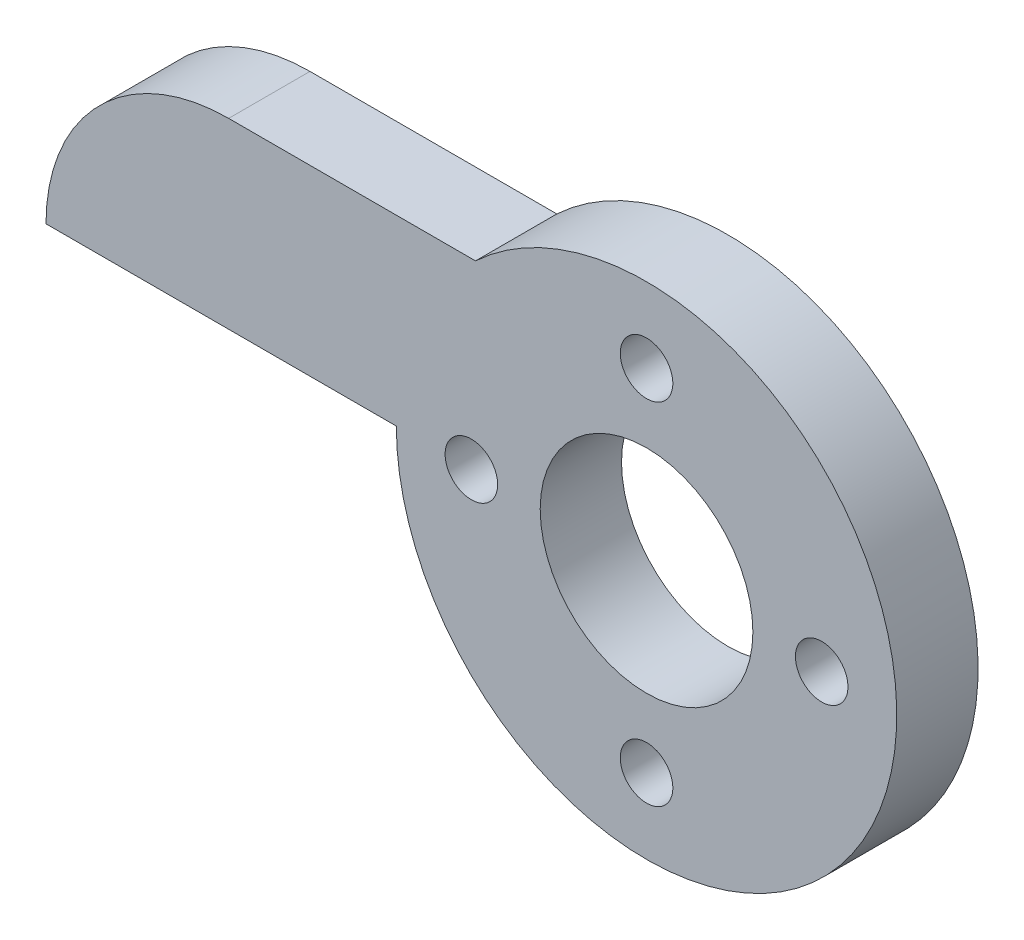
ISO-10303-21;
HEADER;
FILE_DESCRIPTION(('STEP AP214'),'2;1');
FILE_NAME('part.step','',(''),(''),'','','');
FILE_SCHEMA(('AUTOMOTIVE_DESIGN { 1 0 10303 214 1 1 1 1 }'));
ENDSEC;
DATA;
#1=APPLICATION_CONTEXT('core data for automotive mechanical design processes');
#2=APPLICATION_PROTOCOL_DEFINITION('international standard','automotive_design',2000,#1);
#3=PRODUCT_CONTEXT('',#1,'mechanical');
#4=PRODUCT('Part','Part','',(#3));
#5=PRODUCT_RELATED_PRODUCT_CATEGORY('part','',(#4));
#6=PRODUCT_DEFINITION_FORMATION('','',#4);
#7=PRODUCT_DEFINITION_CONTEXT('part definition',#1,'design');
#8=PRODUCT_DEFINITION('design','',#6,#7);
#9=PRODUCT_DEFINITION_SHAPE('','',#8);
#10=(LENGTH_UNIT() NAMED_UNIT(*) SI_UNIT(.MILLI.,.METRE.));
#11=(NAMED_UNIT(*) PLANE_ANGLE_UNIT() SI_UNIT($,.RADIAN.));
#12=(NAMED_UNIT(*) SI_UNIT($,.STERADIAN.) SOLID_ANGLE_UNIT());
#13=UNCERTAINTY_MEASURE_WITH_UNIT(LENGTH_MEASURE(1.E-05),#10,'distance_accuracy_value','');
#14=(GEOMETRIC_REPRESENTATION_CONTEXT(3) GLOBAL_UNCERTAINTY_ASSIGNED_CONTEXT((#13)) GLOBAL_UNIT_ASSIGNED_CONTEXT((#10,
#11,#12)) REPRESENTATION_CONTEXT('',''));
#15=CARTESIAN_POINT('',(0.,0.,0.));
#16=DIRECTION('',(0.,0.,1.));
#17=DIRECTION('',(1.,0.,0.));
#18=AXIS2_PLACEMENT_3D('',#15,#16,#17);
#19=CARTESIAN_POINT('',(-16.7,0.,3.25));
#20=DIRECTION('',(0.,0.,-1.));
#21=DIRECTION('',(-1.,0.,0.));
#22=AXIS2_PLACEMENT_3D('',#19,#20,#21);
#23=CYLINDRICAL_SURFACE('',#22,7.3);
#24=CARTESIAN_POINT('',(-16.7,0.,0.));
#25=DIRECTION('',(0.,0.,1.));
#26=DIRECTION('',(1.,0.,0.));
#27=AXIS2_PLACEMENT_3D('',#24,#25,#26);
#28=CIRCLE('',#27,7.3);
#29=CARTESIAN_POINT('',(-24.,0.,0.));
#30=VERTEX_POINT('',#29);
#31=CARTESIAN_POINT('',(-16.7,7.3,0.));
#32=VERTEX_POINT('',#31);
#33=EDGE_CURVE('E123',#30,#32,#28,.F.);
#34=ORIENTED_EDGE('',*,*,#33,.F.);
#35=DIRECTION('',(0.,0.,-1.));
#36=VECTOR('',#35,1.);
#37=CARTESIAN_POINT('',(-24.,0.,3.25));
#38=LINE('',#37,#36);
#39=CARTESIAN_POINT('',(-24.,0.,3.25));
#40=VERTEX_POINT('',#39);
#41=EDGE_CURVE('E11',#40,#30,#38,.T.);
#42=ORIENTED_EDGE('',*,*,#41,.F.);
#43=CARTESIAN_POINT('',(-16.7,0.,3.25));
#44=DIRECTION('',(0.,0.,1.));
#45=DIRECTION('',(1.,0.,0.));
#46=AXIS2_PLACEMENT_3D('',#43,#44,#45);
#47=CIRCLE('',#46,7.3);
#48=CARTESIAN_POINT('',(-16.7,7.3,3.25));
#49=VERTEX_POINT('',#48);
#50=EDGE_CURVE('E102',#40,#49,#47,.F.);
#51=ORIENTED_EDGE('',*,*,#50,.T.);
#52=DIRECTION('',(0.,0.,-1.));
#53=VECTOR('',#52,1.);
#54=CARTESIAN_POINT('',(-16.7,7.3,3.25));
#55=LINE('',#54,#53);
#56=EDGE_CURVE('E59',#49,#32,#55,.T.);
#57=ORIENTED_EDGE('',*,*,#56,.T.);
#58=EDGE_LOOP('',(#34,#42,#51,#57));
#59=FACE_BOUND('',#58,.T.);
#60=ADVANCED_FACE('F43',(#59),#23,.T.);
#61=CARTESIAN_POINT('',(0.,0.,3.25));
#62=DIRECTION('',(0.,-1.,0.));
#63=DIRECTION('',(1.,0.,0.));
#64=AXIS2_PLACEMENT_3D('',#61,#62,#63);
#65=PLANE('',#64);
#66=DIRECTION('',(-1.,0.,0.));
#67=VECTOR('',#66,1.);
#68=CARTESIAN_POINT('',(0.,0.,0.));
#69=LINE('',#68,#67);
#70=CARTESIAN_POINT('',(-10.,0.,0.));
#71=VERTEX_POINT('',#70);
#72=EDGE_CURVE('E91',#71,#30,#69,.T.);
#73=ORIENTED_EDGE('',*,*,#72,.F.);
#74=DIRECTION('',(0.,0.,-1.));
#75=VECTOR('',#74,1.);
#76=CARTESIAN_POINT('',(-10.,0.,3.25));
#77=LINE('',#76,#75);
#78=CARTESIAN_POINT('',(-10.,0.,3.25));
#79=VERTEX_POINT('',#78);
#80=EDGE_CURVE('E51',#79,#71,#77,.T.);
#81=ORIENTED_EDGE('',*,*,#80,.F.);
#82=DIRECTION('',(-1.,0.,0.));
#83=VECTOR('',#82,1.);
#84=CARTESIAN_POINT('',(0.,0.,3.25));
#85=LINE('',#84,#83);
#86=EDGE_CURVE('E89',#79,#40,#85,.T.);
#87=ORIENTED_EDGE('',*,*,#86,.T.);
#88=ORIENTED_EDGE('',*,*,#41,.T.);
#89=EDGE_LOOP('',(#73,#81,#87,#88));
#90=FACE_BOUND('',#89,.T.);
#91=ADVANCED_FACE('F87',(#90),#65,.T.);
#92=CARTESIAN_POINT('',(0.,0.,3.25));
#93=DIRECTION('',(0.,0.,-1.));
#94=DIRECTION('',(-1.,0.,0.));
#95=AXIS2_PLACEMENT_3D('',#92,#93,#94);
#96=CYLINDRICAL_SURFACE('',#95,10.);
#97=CARTESIAN_POINT('',(0.,0.,0.));
#98=DIRECTION('',(0.,0.,1.));
#99=DIRECTION('',(1.,0.,0.));
#100=AXIS2_PLACEMENT_3D('',#97,#98,#99);
#101=CIRCLE('',#100,10.);
#102=CARTESIAN_POINT('',(-6.83447144993672,7.3,0.));
#103=VERTEX_POINT('',#102);
#104=EDGE_CURVE('E126',#71,#103,#101,.T.);
#105=ORIENTED_EDGE('',*,*,#104,.T.);
#106=DIRECTION('',(0.,0.,-1.));
#107=VECTOR('',#106,1.);
#108=CARTESIAN_POINT('',(-6.83447144993672,7.3,3.25));
#109=LINE('',#108,#107);
#110=CARTESIAN_POINT('',(-6.83447144993672,7.3,3.25));
#111=VERTEX_POINT('',#110);
#112=EDGE_CURVE('E73',#111,#103,#109,.T.);
#113=ORIENTED_EDGE('',*,*,#112,.F.);
#114=CARTESIAN_POINT('',(0.,0.,3.25));
#115=DIRECTION('',(0.,0.,1.));
#116=DIRECTION('',(1.,0.,0.));
#117=AXIS2_PLACEMENT_3D('',#114,#115,#116);
#118=CIRCLE('',#117,10.);
#119=EDGE_CURVE('E94',#79,#111,#118,.T.);
#120=ORIENTED_EDGE('',*,*,#119,.F.);
#121=ORIENTED_EDGE('',*,*,#80,.T.);
#122=EDGE_LOOP('',(#105,#113,#120,#121));
#123=FACE_BOUND('',#122,.T.);
#124=ADVANCED_FACE('F95',(#123),#96,.T.);
#125=CARTESIAN_POINT('',(7.,0.,3.25));
#126=DIRECTION('',(0.,0.,-1.));
#127=DIRECTION('',(-1.,0.,0.));
#128=AXIS2_PLACEMENT_3D('',#125,#126,#127);
#129=CYLINDRICAL_SURFACE('',#128,1.05);
#130=CARTESIAN_POINT('',(7.,0.,3.25));
#131=DIRECTION('',(0.,0.,1.));
#132=DIRECTION('',(1.,0.,0.));
#133=AXIS2_PLACEMENT_3D('',#130,#131,#132);
#134=CIRCLE('',#133,1.05);
#135=CARTESIAN_POINT('',(5.95,0.,3.25));
#136=VERTEX_POINT('',#135);
#137=EDGE_CURVE('E117',#136,#136,#134,.T.);
#138=CARTESIAN_POINT('',(7.,0.,0.));
#139=DIRECTION('',(0.,0.,1.));
#140=DIRECTION('',(1.,0.,0.));
#141=AXIS2_PLACEMENT_3D('',#138,#139,#140);
#142=CIRCLE('',#141,1.05);
#143=CARTESIAN_POINT('',(5.95,0.,0.));
#144=VERTEX_POINT('',#143);
#145=EDGE_CURVE('E140',#144,#144,#142,.T.);
#146=CARTESIAN_POINT('',(5.95,0.,3.25));
#147=CARTESIAN_POINT('',(5.95,0.,3.21614583333333));
#148=CARTESIAN_POINT('',(5.95,0.,3.18229166666667));
#149=CARTESIAN_POINT('',(5.95,0.,3.11458333333333));
#150=CARTESIAN_POINT('',(5.95,0.,3.08072916666667));
#151=CARTESIAN_POINT('',(5.95,0.,3.01302083333333));
#152=CARTESIAN_POINT('',(5.95,0.,2.97916666666667));
#153=CARTESIAN_POINT('',(5.95,0.,2.91145833333333));
#154=CARTESIAN_POINT('',(5.95,0.,2.87760416666667));
#155=CARTESIAN_POINT('',(5.95,0.,2.80989583333333));
#156=CARTESIAN_POINT('',(5.95,0.,2.77604166666667));
#157=CARTESIAN_POINT('',(5.95,0.,2.70833333333333));
#158=CARTESIAN_POINT('',(5.95,0.,2.67447916666667));
#159=CARTESIAN_POINT('',(5.95,0.,2.60677083333333));
#160=CARTESIAN_POINT('',(5.95,0.,2.57291666666667));
#161=CARTESIAN_POINT('',(5.95,0.,2.50520833333333));
#162=CARTESIAN_POINT('',(5.95,0.,2.47135416666667));
#163=CARTESIAN_POINT('',(5.95,0.,2.40364583333333));
#164=CARTESIAN_POINT('',(5.95,0.,2.36979166666667));
#165=CARTESIAN_POINT('',(5.95,0.,2.30208333333333));
#166=CARTESIAN_POINT('',(5.95,0.,2.26822916666667));
#167=CARTESIAN_POINT('',(5.95,0.,2.20052083333333));
#168=CARTESIAN_POINT('',(5.95,0.,2.16666666666667));
#169=CARTESIAN_POINT('',(5.95,0.,2.09895833333333));
#170=CARTESIAN_POINT('',(5.95,0.,2.06510416666667));
#171=CARTESIAN_POINT('',(5.95,0.,1.99739583333333));
#172=CARTESIAN_POINT('',(5.95,0.,1.96354166666667));
#173=CARTESIAN_POINT('',(5.95,0.,1.89583333333333));
#174=CARTESIAN_POINT('',(5.95,0.,1.86197916666667));
#175=CARTESIAN_POINT('',(5.95,0.,1.79427083333333));
#176=CARTESIAN_POINT('',(5.95,0.,1.76041666666667));
#177=CARTESIAN_POINT('',(5.95,0.,1.69270833333333));
#178=CARTESIAN_POINT('',(5.95,0.,1.65885416666667));
#179=CARTESIAN_POINT('',(5.95,0.,1.59114583333333));
#180=CARTESIAN_POINT('',(5.95,0.,1.55729166666667));
#181=CARTESIAN_POINT('',(5.95,0.,1.48958333333333));
#182=CARTESIAN_POINT('',(5.95,0.,1.45572916666667));
#183=CARTESIAN_POINT('',(5.95,0.,1.38802083333333));
#184=CARTESIAN_POINT('',(5.95,0.,1.35416666666667));
#185=CARTESIAN_POINT('',(5.95,0.,1.28645833333333));
#186=CARTESIAN_POINT('',(5.95,0.,1.25260416666667));
#187=CARTESIAN_POINT('',(5.95,0.,1.18489583333333));
#188=CARTESIAN_POINT('',(5.95,0.,1.15104166666667));
#189=CARTESIAN_POINT('',(5.95,0.,1.08333333333333));
#190=CARTESIAN_POINT('',(5.95,0.,1.04947916666667));
#191=CARTESIAN_POINT('',(5.95,0.,0.981770833333333));
#192=CARTESIAN_POINT('',(5.95,0.,0.947916666666667));
#193=CARTESIAN_POINT('',(5.95,0.,0.880208333333333));
#194=CARTESIAN_POINT('',(5.95,0.,0.846354166666667));
#195=CARTESIAN_POINT('',(5.95,0.,0.778645833333333));
#196=CARTESIAN_POINT('',(5.95,0.,0.744791666666667));
#197=CARTESIAN_POINT('',(5.95,0.,0.677083333333333));
#198=CARTESIAN_POINT('',(5.95,0.,0.643229166666667));
#199=CARTESIAN_POINT('',(5.95,0.,0.575520833333333));
#200=CARTESIAN_POINT('',(5.95,0.,0.541666666666667));
#201=CARTESIAN_POINT('',(5.95,0.,0.473958333333333));
#202=CARTESIAN_POINT('',(5.95,0.,0.440104166666667));
#203=CARTESIAN_POINT('',(5.95,0.,0.372395833333333));
#204=CARTESIAN_POINT('',(5.95,0.,0.338541666666667));
#205=CARTESIAN_POINT('',(5.95,0.,0.270833333333333));
#206=CARTESIAN_POINT('',(5.95,0.,0.236979166666667));
#207=CARTESIAN_POINT('',(5.95,0.,0.169270833333333));
#208=CARTESIAN_POINT('',(5.95,0.,0.135416666666667));
#209=CARTESIAN_POINT('',(5.95,0.,0.0677083333333334));
#210=CARTESIAN_POINT('',(5.95,0.,0.0338541666666667));
#211=CARTESIAN_POINT('',(5.95,0.,0.));
#212=B_SPLINE_CURVE_WITH_KNOTS('',3,(#146,#147,#148,#149,#150,#151,#152,#153,#154,#155,#156,
#157,#158,#159,#160,#161,#162,#163,#164,#165,#166,#167,#168,#169,#170,#171,#172,#173,#174,#175,
#176,#177,#178,#179,#180,#181,#182,#183,#184,#185,#186,#187,#188,#189,#190,#191,#192,#193,#194,
#195,#196,#197,#198,#199,#200,#201,#202,#203,#204,#205,#206,#207,#208,#209,#210,#211),
.UNSPECIFIED.,.F.,.F.,(4,2,2,2,2,2,2,2,2,2,2,2,2,2,2,2,2,2,2,2,2,2,2,2,2,2,2,2,2,2,2,2,4),(0.,
0.1015625,0.203125,0.3046875,0.40625,0.5078125,0.609375,0.7109375,0.8125,0.9140625,1.015625,
1.1171875,1.21875,1.3203125,1.421875,1.5234375,1.625,1.7265625,1.828125,1.9296875,2.03125,
2.1328125,2.234375,2.3359375,2.4375,2.5390625,2.640625,2.7421875,2.84375,2.9453125,3.046875,
3.1484375,3.25),.UNSPECIFIED.);
#213=EDGE_CURVE('BSEAM179',#136,#144,#212,.T.);
#214=ORIENTED_EDGE('',*,*,#137,.T.);
#215=ORIENTED_EDGE('',*,*,#145,.F.);
#216=ORIENTED_EDGE('',*,*,#213,.T.);
#217=ORIENTED_EDGE('',*,*,#213,.F.);
#218=EDGE_LOOP('',(#214,#216,#215,#217));
#219=FACE_BOUND('',#218,.T.);
#220=ADVANCED_FACE('F179',(#219),#129,.F.);
#221=CARTESIAN_POINT('',(0.,7.,3.25));
#222=DIRECTION('',(0.,0.,-1.));
#223=DIRECTION('',(-1.,0.,0.));
#224=AXIS2_PLACEMENT_3D('',#221,#222,#223);
#225=CYLINDRICAL_SURFACE('',#224,1.05);
#226=CARTESIAN_POINT('',(0.,7.,3.25));
#227=DIRECTION('',(0.,0.,1.));
#228=DIRECTION('',(1.,0.,0.));
#229=AXIS2_PLACEMENT_3D('',#226,#227,#228);
#230=CIRCLE('',#229,1.05);
#231=CARTESIAN_POINT('',(-1.05,7.,3.25));
#232=VERTEX_POINT('',#231);
#233=EDGE_CURVE('E114',#232,#232,#230,.T.);
#234=CARTESIAN_POINT('',(0.,7.,0.));
#235=DIRECTION('',(0.,0.,1.));
#236=DIRECTION('',(1.,0.,0.));
#237=AXIS2_PLACEMENT_3D('',#234,#235,#236);
#238=CIRCLE('',#237,1.05);
#239=CARTESIAN_POINT('',(-1.05,7.,0.));
#240=VERTEX_POINT('',#239);
#241=EDGE_CURVE('E137',#240,#240,#238,.T.);
#242=CARTESIAN_POINT('',(-1.05,7.,3.25));
#243=CARTESIAN_POINT('',(-1.05,7.,3.21614583333333));
#244=CARTESIAN_POINT('',(-1.05,7.,3.18229166666667));
#245=CARTESIAN_POINT('',(-1.05,7.,3.11458333333333));
#246=CARTESIAN_POINT('',(-1.05,7.,3.08072916666667));
#247=CARTESIAN_POINT('',(-1.05,7.,3.01302083333333));
#248=CARTESIAN_POINT('',(-1.05,7.,2.97916666666667));
#249=CARTESIAN_POINT('',(-1.05,7.,2.91145833333333));
#250=CARTESIAN_POINT('',(-1.05,7.,2.87760416666667));
#251=CARTESIAN_POINT('',(-1.05,7.,2.80989583333333));
#252=CARTESIAN_POINT('',(-1.05,7.,2.77604166666667));
#253=CARTESIAN_POINT('',(-1.05,7.,2.70833333333333));
#254=CARTESIAN_POINT('',(-1.05,7.,2.67447916666667));
#255=CARTESIAN_POINT('',(-1.05,7.,2.60677083333333));
#256=CARTESIAN_POINT('',(-1.05,7.,2.57291666666667));
#257=CARTESIAN_POINT('',(-1.05,7.,2.50520833333333));
#258=CARTESIAN_POINT('',(-1.05,7.,2.47135416666667));
#259=CARTESIAN_POINT('',(-1.05,7.,2.40364583333333));
#260=CARTESIAN_POINT('',(-1.05,7.,2.36979166666667));
#261=CARTESIAN_POINT('',(-1.05,7.,2.30208333333333));
#262=CARTESIAN_POINT('',(-1.05,7.,2.26822916666667));
#263=CARTESIAN_POINT('',(-1.05,7.,2.20052083333333));
#264=CARTESIAN_POINT('',(-1.05,7.,2.16666666666667));
#265=CARTESIAN_POINT('',(-1.05,7.,2.09895833333333));
#266=CARTESIAN_POINT('',(-1.05,7.,2.06510416666667));
#267=CARTESIAN_POINT('',(-1.05,7.,1.99739583333333));
#268=CARTESIAN_POINT('',(-1.05,7.,1.96354166666667));
#269=CARTESIAN_POINT('',(-1.05,7.,1.89583333333333));
#270=CARTESIAN_POINT('',(-1.05,7.,1.86197916666667));
#271=CARTESIAN_POINT('',(-1.05,7.,1.79427083333333));
#272=CARTESIAN_POINT('',(-1.05,7.,1.76041666666667));
#273=CARTESIAN_POINT('',(-1.05,7.,1.69270833333333));
#274=CARTESIAN_POINT('',(-1.05,7.,1.65885416666667));
#275=CARTESIAN_POINT('',(-1.05,7.,1.59114583333333));
#276=CARTESIAN_POINT('',(-1.05,7.,1.55729166666667));
#277=CARTESIAN_POINT('',(-1.05,7.,1.48958333333333));
#278=CARTESIAN_POINT('',(-1.05,7.,1.45572916666667));
#279=CARTESIAN_POINT('',(-1.05,7.,1.38802083333333));
#280=CARTESIAN_POINT('',(-1.05,7.,1.35416666666667));
#281=CARTESIAN_POINT('',(-1.05,7.,1.28645833333333));
#282=CARTESIAN_POINT('',(-1.05,7.,1.25260416666667));
#283=CARTESIAN_POINT('',(-1.05,7.,1.18489583333333));
#284=CARTESIAN_POINT('',(-1.05,7.,1.15104166666667));
#285=CARTESIAN_POINT('',(-1.05,7.,1.08333333333333));
#286=CARTESIAN_POINT('',(-1.05,7.,1.04947916666667));
#287=CARTESIAN_POINT('',(-1.05,7.,0.981770833333333));
#288=CARTESIAN_POINT('',(-1.05,7.,0.947916666666667));
#289=CARTESIAN_POINT('',(-1.05,7.,0.880208333333333));
#290=CARTESIAN_POINT('',(-1.05,7.,0.846354166666667));
#291=CARTESIAN_POINT('',(-1.05,7.,0.778645833333333));
#292=CARTESIAN_POINT('',(-1.05,7.,0.744791666666667));
#293=CARTESIAN_POINT('',(-1.05,7.,0.677083333333333));
#294=CARTESIAN_POINT('',(-1.05,7.,0.643229166666667));
#295=CARTESIAN_POINT('',(-1.05,7.,0.575520833333333));
#296=CARTESIAN_POINT('',(-1.05,7.,0.541666666666667));
#297=CARTESIAN_POINT('',(-1.05,7.,0.473958333333333));
#298=CARTESIAN_POINT('',(-1.05,7.,0.440104166666667));
#299=CARTESIAN_POINT('',(-1.05,7.,0.372395833333333));
#300=CARTESIAN_POINT('',(-1.05,7.,0.338541666666667));
#301=CARTESIAN_POINT('',(-1.05,7.,0.270833333333333));
#302=CARTESIAN_POINT('',(-1.05,7.,0.236979166666667));
#303=CARTESIAN_POINT('',(-1.05,7.,0.169270833333333));
#304=CARTESIAN_POINT('',(-1.05,7.,0.135416666666667));
#305=CARTESIAN_POINT('',(-1.05,7.,0.0677083333333334));
#306=CARTESIAN_POINT('',(-1.05,7.,0.0338541666666667));
#307=CARTESIAN_POINT('',(-1.05,7.,0.));
#308=B_SPLINE_CURVE_WITH_KNOTS('',3,(#242,#243,#244,#245,#246,#247,#248,#249,#250,#251,#252,
#253,#254,#255,#256,#257,#258,#259,#260,#261,#262,#263,#264,#265,#266,#267,#268,#269,#270,#271,
#272,#273,#274,#275,#276,#277,#278,#279,#280,#281,#282,#283,#284,#285,#286,#287,#288,#289,#290,
#291,#292,#293,#294,#295,#296,#297,#298,#299,#300,#301,#302,#303,#304,#305,#306,#307),
.UNSPECIFIED.,.F.,.F.,(4,2,2,2,2,2,2,2,2,2,2,2,2,2,2,2,2,2,2,2,2,2,2,2,2,2,2,2,2,2,2,2,4),(0.,
0.1015625,0.203125,0.3046875,0.40625,0.5078125,0.609375,0.7109375,0.8125,0.9140625,1.015625,
1.1171875,1.21875,1.3203125,1.421875,1.5234375,1.625,1.7265625,1.828125,1.9296875,2.03125,
2.1328125,2.234375,2.3359375,2.4375,2.5390625,2.640625,2.7421875,2.84375,2.9453125,3.046875,
3.1484375,3.25),.UNSPECIFIED.);
#309=EDGE_CURVE('BSEAM181',#232,#240,#308,.T.);
#310=ORIENTED_EDGE('',*,*,#233,.T.);
#311=ORIENTED_EDGE('',*,*,#241,.F.);
#312=ORIENTED_EDGE('',*,*,#309,.T.);
#313=ORIENTED_EDGE('',*,*,#309,.F.);
#314=EDGE_LOOP('',(#310,#312,#311,#313));
#315=FACE_BOUND('',#314,.T.);
#316=ADVANCED_FACE('F181',(#315),#225,.F.);
#317=CARTESIAN_POINT('',(-7.,0.,3.25));
#318=DIRECTION('',(0.,0.,-1.));
#319=DIRECTION('',(-1.,0.,0.));
#320=AXIS2_PLACEMENT_3D('',#317,#318,#319);
#321=CYLINDRICAL_SURFACE('',#320,1.05);
#322=CARTESIAN_POINT('',(-7.,0.,3.25));
#323=DIRECTION('',(0.,0.,1.));
#324=DIRECTION('',(1.,0.,0.));
#325=AXIS2_PLACEMENT_3D('',#322,#323,#324);
#326=CIRCLE('',#325,1.05);
#327=CARTESIAN_POINT('',(-8.05,0.,3.25));
#328=VERTEX_POINT('',#327);
#329=EDGE_CURVE('E111',#328,#328,#326,.T.);
#330=CARTESIAN_POINT('',(-7.,0.,0.));
#331=DIRECTION('',(0.,0.,1.));
#332=DIRECTION('',(1.,0.,0.));
#333=AXIS2_PLACEMENT_3D('',#330,#331,#332);
#334=CIRCLE('',#333,1.05);
#335=CARTESIAN_POINT('',(-8.05,0.,0.));
#336=VERTEX_POINT('',#335);
#337=EDGE_CURVE('E134',#336,#336,#334,.T.);
#338=CARTESIAN_POINT('',(-8.05,0.,3.25));
#339=CARTESIAN_POINT('',(-8.05,0.,3.21614583333333));
#340=CARTESIAN_POINT('',(-8.05,0.,3.18229166666667));
#341=CARTESIAN_POINT('',(-8.05,0.,3.11458333333333));
#342=CARTESIAN_POINT('',(-8.05,0.,3.08072916666667));
#343=CARTESIAN_POINT('',(-8.05,0.,3.01302083333333));
#344=CARTESIAN_POINT('',(-8.05,0.,2.97916666666667));
#345=CARTESIAN_POINT('',(-8.05,0.,2.91145833333333));
#346=CARTESIAN_POINT('',(-8.05,0.,2.87760416666667));
#347=CARTESIAN_POINT('',(-8.05,0.,2.80989583333333));
#348=CARTESIAN_POINT('',(-8.05,0.,2.77604166666667));
#349=CARTESIAN_POINT('',(-8.05,0.,2.70833333333333));
#350=CARTESIAN_POINT('',(-8.05,0.,2.67447916666667));
#351=CARTESIAN_POINT('',(-8.05,0.,2.60677083333333));
#352=CARTESIAN_POINT('',(-8.05,0.,2.57291666666667));
#353=CARTESIAN_POINT('',(-8.05,0.,2.50520833333333));
#354=CARTESIAN_POINT('',(-8.05,0.,2.47135416666667));
#355=CARTESIAN_POINT('',(-8.05,0.,2.40364583333333));
#356=CARTESIAN_POINT('',(-8.05,0.,2.36979166666667));
#357=CARTESIAN_POINT('',(-8.05,0.,2.30208333333333));
#358=CARTESIAN_POINT('',(-8.05,0.,2.26822916666667));
#359=CARTESIAN_POINT('',(-8.05,0.,2.20052083333333));
#360=CARTESIAN_POINT('',(-8.05,0.,2.16666666666667));
#361=CARTESIAN_POINT('',(-8.05,0.,2.09895833333333));
#362=CARTESIAN_POINT('',(-8.05,0.,2.06510416666667));
#363=CARTESIAN_POINT('',(-8.05,0.,1.99739583333333));
#364=CARTESIAN_POINT('',(-8.05,0.,1.96354166666667));
#365=CARTESIAN_POINT('',(-8.05,0.,1.89583333333333));
#366=CARTESIAN_POINT('',(-8.05,0.,1.86197916666667));
#367=CARTESIAN_POINT('',(-8.05,0.,1.79427083333333));
#368=CARTESIAN_POINT('',(-8.05,0.,1.76041666666667));
#369=CARTESIAN_POINT('',(-8.05,0.,1.69270833333333));
#370=CARTESIAN_POINT('',(-8.05,0.,1.65885416666667));
#371=CARTESIAN_POINT('',(-8.05,0.,1.59114583333333));
#372=CARTESIAN_POINT('',(-8.05,0.,1.55729166666667));
#373=CARTESIAN_POINT('',(-8.05,0.,1.48958333333333));
#374=CARTESIAN_POINT('',(-8.05,0.,1.45572916666667));
#375=CARTESIAN_POINT('',(-8.05,0.,1.38802083333333));
#376=CARTESIAN_POINT('',(-8.05,0.,1.35416666666667));
#377=CARTESIAN_POINT('',(-8.05,0.,1.28645833333333));
#378=CARTESIAN_POINT('',(-8.05,0.,1.25260416666667));
#379=CARTESIAN_POINT('',(-8.05,0.,1.18489583333333));
#380=CARTESIAN_POINT('',(-8.05,0.,1.15104166666667));
#381=CARTESIAN_POINT('',(-8.05,0.,1.08333333333333));
#382=CARTESIAN_POINT('',(-8.05,0.,1.04947916666667));
#383=CARTESIAN_POINT('',(-8.05,0.,0.981770833333333));
#384=CARTESIAN_POINT('',(-8.05,0.,0.947916666666667));
#385=CARTESIAN_POINT('',(-8.05,0.,0.880208333333333));
#386=CARTESIAN_POINT('',(-8.05,0.,0.846354166666667));
#387=CARTESIAN_POINT('',(-8.05,0.,0.778645833333333));
#388=CARTESIAN_POINT('',(-8.05,0.,0.744791666666667));
#389=CARTESIAN_POINT('',(-8.05,0.,0.677083333333333));
#390=CARTESIAN_POINT('',(-8.05,0.,0.643229166666667));
#391=CARTESIAN_POINT('',(-8.05,0.,0.575520833333333));
#392=CARTESIAN_POINT('',(-8.05,0.,0.541666666666667));
#393=CARTESIAN_POINT('',(-8.05,0.,0.473958333333333));
#394=CARTESIAN_POINT('',(-8.05,0.,0.440104166666667));
#395=CARTESIAN_POINT('',(-8.05,0.,0.372395833333333));
#396=CARTESIAN_POINT('',(-8.05,0.,0.338541666666667));
#397=CARTESIAN_POINT('',(-8.05,0.,0.270833333333333));
#398=CARTESIAN_POINT('',(-8.05,0.,0.236979166666667));
#399=CARTESIAN_POINT('',(-8.05,0.,0.169270833333333));
#400=CARTESIAN_POINT('',(-8.05,0.,0.135416666666667));
#401=CARTESIAN_POINT('',(-8.05,0.,0.0677083333333334));
#402=CARTESIAN_POINT('',(-8.05,0.,0.0338541666666667));
#403=CARTESIAN_POINT('',(-8.05,0.,0.));
#404=B_SPLINE_CURVE_WITH_KNOTS('',3,(#338,#339,#340,#341,#342,#343,#344,#345,#346,#347,#348,
#349,#350,#351,#352,#353,#354,#355,#356,#357,#358,#359,#360,#361,#362,#363,#364,#365,#366,#367,
#368,#369,#370,#371,#372,#373,#374,#375,#376,#377,#378,#379,#380,#381,#382,#383,#384,#385,#386,
#387,#388,#389,#390,#391,#392,#393,#394,#395,#396,#397,#398,#399,#400,#401,#402,#403),
.UNSPECIFIED.,.F.,.F.,(4,2,2,2,2,2,2,2,2,2,2,2,2,2,2,2,2,2,2,2,2,2,2,2,2,2,2,2,2,2,2,2,4),(0.,
0.1015625,0.203125,0.3046875,0.40625,0.5078125,0.609375,0.7109375,0.8125,0.9140625,1.015625,
1.1171875,1.21875,1.3203125,1.421875,1.5234375,1.625,1.7265625,1.828125,1.9296875,2.03125,
2.1328125,2.234375,2.3359375,2.4375,2.5390625,2.640625,2.7421875,2.84375,2.9453125,3.046875,
3.1484375,3.25),.UNSPECIFIED.);
#405=EDGE_CURVE('BSEAM187',#328,#336,#404,.T.);
#406=ORIENTED_EDGE('',*,*,#329,.T.);
#407=ORIENTED_EDGE('',*,*,#337,.F.);
#408=ORIENTED_EDGE('',*,*,#405,.T.);
#409=ORIENTED_EDGE('',*,*,#405,.F.);
#410=EDGE_LOOP('',(#406,#408,#407,#409));
#411=FACE_BOUND('',#410,.T.);
#412=ADVANCED_FACE('F187',(#411),#321,.F.);
#413=CARTESIAN_POINT('',(0.,-7.,3.25));
#414=DIRECTION('',(0.,0.,-1.));
#415=DIRECTION('',(-1.,0.,0.));
#416=AXIS2_PLACEMENT_3D('',#413,#414,#415);
#417=CYLINDRICAL_SURFACE('',#416,1.05);
#418=CARTESIAN_POINT('',(0.,-7.,3.25));
#419=DIRECTION('',(0.,0.,1.));
#420=DIRECTION('',(1.,0.,0.));
#421=AXIS2_PLACEMENT_3D('',#418,#419,#420);
#422=CIRCLE('',#421,1.05);
#423=CARTESIAN_POINT('',(-1.05,-7.,3.25));
#424=VERTEX_POINT('',#423);
#425=EDGE_CURVE('E108',#424,#424,#422,.T.);
#426=CARTESIAN_POINT('',(0.,-7.,0.));
#427=DIRECTION('',(0.,0.,1.));
#428=DIRECTION('',(1.,0.,0.));
#429=AXIS2_PLACEMENT_3D('',#426,#427,#428);
#430=CIRCLE('',#429,1.05);
#431=CARTESIAN_POINT('',(-1.05,-7.,0.));
#432=VERTEX_POINT('',#431);
#433=EDGE_CURVE('E131',#432,#432,#430,.T.);
#434=CARTESIAN_POINT('',(-1.05,-7.,3.25));
#435=CARTESIAN_POINT('',(-1.05,-7.,3.21614583333333));
#436=CARTESIAN_POINT('',(-1.05,-7.,3.18229166666667));
#437=CARTESIAN_POINT('',(-1.05,-7.,3.11458333333333));
#438=CARTESIAN_POINT('',(-1.05,-7.,3.08072916666667));
#439=CARTESIAN_POINT('',(-1.05,-7.,3.01302083333333));
#440=CARTESIAN_POINT('',(-1.05,-7.,2.97916666666667));
#441=CARTESIAN_POINT('',(-1.05,-7.,2.91145833333333));
#442=CARTESIAN_POINT('',(-1.05,-7.,2.87760416666667));
#443=CARTESIAN_POINT('',(-1.05,-7.,2.80989583333333));
#444=CARTESIAN_POINT('',(-1.05,-7.,2.77604166666667));
#445=CARTESIAN_POINT('',(-1.05,-7.,2.70833333333333));
#446=CARTESIAN_POINT('',(-1.05,-7.,2.67447916666667));
#447=CARTESIAN_POINT('',(-1.05,-7.,2.60677083333333));
#448=CARTESIAN_POINT('',(-1.05,-7.,2.57291666666667));
#449=CARTESIAN_POINT('',(-1.05,-7.,2.50520833333333));
#450=CARTESIAN_POINT('',(-1.05,-7.,2.47135416666667));
#451=CARTESIAN_POINT('',(-1.05,-7.,2.40364583333333));
#452=CARTESIAN_POINT('',(-1.05,-7.,2.36979166666667));
#453=CARTESIAN_POINT('',(-1.05,-7.,2.30208333333333));
#454=CARTESIAN_POINT('',(-1.05,-7.,2.26822916666667));
#455=CARTESIAN_POINT('',(-1.05,-7.,2.20052083333333));
#456=CARTESIAN_POINT('',(-1.05,-7.,2.16666666666667));
#457=CARTESIAN_POINT('',(-1.05,-7.,2.09895833333333));
#458=CARTESIAN_POINT('',(-1.05,-7.,2.06510416666667));
#459=CARTESIAN_POINT('',(-1.05,-7.,1.99739583333333));
#460=CARTESIAN_POINT('',(-1.05,-7.,1.96354166666667));
#461=CARTESIAN_POINT('',(-1.05,-7.,1.89583333333333));
#462=CARTESIAN_POINT('',(-1.05,-7.,1.86197916666667));
#463=CARTESIAN_POINT('',(-1.05,-7.,1.79427083333333));
#464=CARTESIAN_POINT('',(-1.05,-7.,1.76041666666667));
#465=CARTESIAN_POINT('',(-1.05,-7.,1.69270833333333));
#466=CARTESIAN_POINT('',(-1.05,-7.,1.65885416666667));
#467=CARTESIAN_POINT('',(-1.05,-7.,1.59114583333333));
#468=CARTESIAN_POINT('',(-1.05,-7.,1.55729166666667));
#469=CARTESIAN_POINT('',(-1.05,-7.,1.48958333333333));
#470=CARTESIAN_POINT('',(-1.05,-7.,1.45572916666667));
#471=CARTESIAN_POINT('',(-1.05,-7.,1.38802083333333));
#472=CARTESIAN_POINT('',(-1.05,-7.,1.35416666666667));
#473=CARTESIAN_POINT('',(-1.05,-7.,1.28645833333333));
#474=CARTESIAN_POINT('',(-1.05,-7.,1.25260416666667));
#475=CARTESIAN_POINT('',(-1.05,-7.,1.18489583333333));
#476=CARTESIAN_POINT('',(-1.05,-7.,1.15104166666667));
#477=CARTESIAN_POINT('',(-1.05,-7.,1.08333333333333));
#478=CARTESIAN_POINT('',(-1.05,-7.,1.04947916666667));
#479=CARTESIAN_POINT('',(-1.05,-7.,0.981770833333333));
#480=CARTESIAN_POINT('',(-1.05,-7.,0.947916666666667));
#481=CARTESIAN_POINT('',(-1.05,-7.,0.880208333333333));
#482=CARTESIAN_POINT('',(-1.05,-7.,0.846354166666667));
#483=CARTESIAN_POINT('',(-1.05,-7.,0.778645833333333));
#484=CARTESIAN_POINT('',(-1.05,-7.,0.744791666666667));
#485=CARTESIAN_POINT('',(-1.05,-7.,0.677083333333333));
#486=CARTESIAN_POINT('',(-1.05,-7.,0.643229166666667));
#487=CARTESIAN_POINT('',(-1.05,-7.,0.575520833333333));
#488=CARTESIAN_POINT('',(-1.05,-7.,0.541666666666667));
#489=CARTESIAN_POINT('',(-1.05,-7.,0.473958333333333));
#490=CARTESIAN_POINT('',(-1.05,-7.,0.440104166666667));
#491=CARTESIAN_POINT('',(-1.05,-7.,0.372395833333333));
#492=CARTESIAN_POINT('',(-1.05,-7.,0.338541666666667));
#493=CARTESIAN_POINT('',(-1.05,-7.,0.270833333333333));
#494=CARTESIAN_POINT('',(-1.05,-7.,0.236979166666667));
#495=CARTESIAN_POINT('',(-1.05,-7.,0.169270833333333));
#496=CARTESIAN_POINT('',(-1.05,-7.,0.135416666666667));
#497=CARTESIAN_POINT('',(-1.05,-7.,0.0677083333333334));
#498=CARTESIAN_POINT('',(-1.05,-7.,0.0338541666666667));
#499=CARTESIAN_POINT('',(-1.05,-7.,0.));
#500=B_SPLINE_CURVE_WITH_KNOTS('',3,(#434,#435,#436,#437,#438,#439,#440,#441,#442,#443,#444,
#445,#446,#447,#448,#449,#450,#451,#452,#453,#454,#455,#456,#457,#458,#459,#460,#461,#462,#463,
#464,#465,#466,#467,#468,#469,#470,#471,#472,#473,#474,#475,#476,#477,#478,#479,#480,#481,#482,
#483,#484,#485,#486,#487,#488,#489,#490,#491,#492,#493,#494,#495,#496,#497,#498,#499),
.UNSPECIFIED.,.F.,.F.,(4,2,2,2,2,2,2,2,2,2,2,2,2,2,2,2,2,2,2,2,2,2,2,2,2,2,2,2,2,2,2,2,4),(0.,
0.1015625,0.203125,0.3046875,0.40625,0.5078125,0.609375,0.7109375,0.8125,0.9140625,1.015625,
1.1171875,1.21875,1.3203125,1.421875,1.5234375,1.625,1.7265625,1.828125,1.9296875,2.03125,
2.1328125,2.234375,2.3359375,2.4375,2.5390625,2.640625,2.7421875,2.84375,2.9453125,3.046875,
3.1484375,3.25),.UNSPECIFIED.);
#501=EDGE_CURVE('BSEAM160',#424,#432,#500,.T.);
#502=ORIENTED_EDGE('',*,*,#425,.T.);
#503=ORIENTED_EDGE('',*,*,#433,.F.);
#504=ORIENTED_EDGE('',*,*,#501,.T.);
#505=ORIENTED_EDGE('',*,*,#501,.F.);
#506=EDGE_LOOP('',(#502,#504,#503,#505));
#507=FACE_BOUND('',#506,.T.);
#508=ADVANCED_FACE('F160',(#507),#417,.F.);
#509=CARTESIAN_POINT('',(0.,7.29999999999999,3.25));
#510=DIRECTION('',(0.,1.,0.));
#511=DIRECTION('',(-1.,0.,0.));
#512=AXIS2_PLACEMENT_3D('',#509,#510,#511);
#513=PLANE('',#512);
#514=DIRECTION('',(1.,0.,0.));
#515=VECTOR('',#514,1.);
#516=CARTESIAN_POINT('',(0.,7.29999999999999,0.));
#517=LINE('',#516,#515);
#518=EDGE_CURVE('E128',#32,#103,#517,.T.);
#519=ORIENTED_EDGE('',*,*,#518,.F.);
#520=ORIENTED_EDGE('',*,*,#56,.F.);
#521=DIRECTION('',(1.,0.,0.));
#522=VECTOR('',#521,1.);
#523=CARTESIAN_POINT('',(0.,7.29999999999999,3.25));
#524=LINE('',#523,#522);
#525=EDGE_CURVE('E98',#49,#111,#524,.T.);
#526=ORIENTED_EDGE('',*,*,#525,.T.);
#527=ORIENTED_EDGE('',*,*,#112,.T.);
#528=EDGE_LOOP('',(#519,#520,#526,#527));
#529=FACE_BOUND('',#528,.T.);
#530=ADVANCED_FACE('F152',(#529),#513,.T.);
#531=CARTESIAN_POINT('',(0.,0.,3.25));
#532=DIRECTION('',(0.,0.,-1.));
#533=DIRECTION('',(-1.,0.,0.));
#534=AXIS2_PLACEMENT_3D('',#531,#532,#533);
#535=CYLINDRICAL_SURFACE('',#534,4.25);
#536=CARTESIAN_POINT('',(0.,0.,3.25));
#537=DIRECTION('',(0.,0.,1.));
#538=DIRECTION('',(1.,0.,0.));
#539=AXIS2_PLACEMENT_3D('',#536,#537,#538);
#540=CIRCLE('',#539,4.25);
#541=CARTESIAN_POINT('',(-4.25,0.,3.25));
#542=VERTEX_POINT('',#541);
#543=EDGE_CURVE('E120',#542,#542,#540,.T.);
#544=CARTESIAN_POINT('',(0.,0.,0.));
#545=DIRECTION('',(0.,0.,1.));
#546=DIRECTION('',(1.,0.,0.));
#547=AXIS2_PLACEMENT_3D('',#544,#545,#546);
#548=CIRCLE('',#547,4.25);
#549=CARTESIAN_POINT('',(-4.25,0.,0.));
#550=VERTEX_POINT('',#549);
#551=EDGE_CURVE('E104',#550,#550,#548,.T.);
#552=CARTESIAN_POINT('',(-4.25,0.,3.25));
#553=CARTESIAN_POINT('',(-4.25,0.,3.21614583333333));
#554=CARTESIAN_POINT('',(-4.25,0.,3.18229166666667));
#555=CARTESIAN_POINT('',(-4.25,0.,3.11458333333333));
#556=CARTESIAN_POINT('',(-4.25,0.,3.08072916666667));
#557=CARTESIAN_POINT('',(-4.25,0.,3.01302083333333));
#558=CARTESIAN_POINT('',(-4.25,0.,2.97916666666667));
#559=CARTESIAN_POINT('',(-4.25,0.,2.91145833333333));
#560=CARTESIAN_POINT('',(-4.25,0.,2.87760416666667));
#561=CARTESIAN_POINT('',(-4.25,0.,2.80989583333333));
#562=CARTESIAN_POINT('',(-4.25,0.,2.77604166666667));
#563=CARTESIAN_POINT('',(-4.25,0.,2.70833333333333));
#564=CARTESIAN_POINT('',(-4.25,0.,2.67447916666667));
#565=CARTESIAN_POINT('',(-4.25,0.,2.60677083333333));
#566=CARTESIAN_POINT('',(-4.25,0.,2.57291666666667));
#567=CARTESIAN_POINT('',(-4.25,0.,2.50520833333333));
#568=CARTESIAN_POINT('',(-4.25,0.,2.47135416666667));
#569=CARTESIAN_POINT('',(-4.25,0.,2.40364583333333));
#570=CARTESIAN_POINT('',(-4.25,0.,2.36979166666667));
#571=CARTESIAN_POINT('',(-4.25,0.,2.30208333333333));
#572=CARTESIAN_POINT('',(-4.25,0.,2.26822916666667));
#573=CARTESIAN_POINT('',(-4.25,0.,2.20052083333333));
#574=CARTESIAN_POINT('',(-4.25,0.,2.16666666666667));
#575=CARTESIAN_POINT('',(-4.25,0.,2.09895833333333));
#576=CARTESIAN_POINT('',(-4.25,0.,2.06510416666667));
#577=CARTESIAN_POINT('',(-4.25,0.,1.99739583333333));
#578=CARTESIAN_POINT('',(-4.25,0.,1.96354166666667));
#579=CARTESIAN_POINT('',(-4.25,0.,1.89583333333333));
#580=CARTESIAN_POINT('',(-4.25,0.,1.86197916666667));
#581=CARTESIAN_POINT('',(-4.25,0.,1.79427083333333));
#582=CARTESIAN_POINT('',(-4.25,0.,1.76041666666667));
#583=CARTESIAN_POINT('',(-4.25,0.,1.69270833333333));
#584=CARTESIAN_POINT('',(-4.25,0.,1.65885416666667));
#585=CARTESIAN_POINT('',(-4.25,0.,1.59114583333333));
#586=CARTESIAN_POINT('',(-4.25,0.,1.55729166666667));
#587=CARTESIAN_POINT('',(-4.25,0.,1.48958333333333));
#588=CARTESIAN_POINT('',(-4.25,0.,1.45572916666667));
#589=CARTESIAN_POINT('',(-4.25,0.,1.38802083333333));
#590=CARTESIAN_POINT('',(-4.25,0.,1.35416666666667));
#591=CARTESIAN_POINT('',(-4.25,0.,1.28645833333333));
#592=CARTESIAN_POINT('',(-4.25,0.,1.25260416666667));
#593=CARTESIAN_POINT('',(-4.25,0.,1.18489583333333));
#594=CARTESIAN_POINT('',(-4.25,0.,1.15104166666667));
#595=CARTESIAN_POINT('',(-4.25,0.,1.08333333333333));
#596=CARTESIAN_POINT('',(-4.25,0.,1.04947916666667));
#597=CARTESIAN_POINT('',(-4.25,0.,0.981770833333333));
#598=CARTESIAN_POINT('',(-4.25,0.,0.947916666666667));
#599=CARTESIAN_POINT('',(-4.25,0.,0.880208333333333));
#600=CARTESIAN_POINT('',(-4.25,0.,0.846354166666667));
#601=CARTESIAN_POINT('',(-4.25,0.,0.778645833333333));
#602=CARTESIAN_POINT('',(-4.25,0.,0.744791666666667));
#603=CARTESIAN_POINT('',(-4.25,0.,0.677083333333333));
#604=CARTESIAN_POINT('',(-4.25,0.,0.643229166666667));
#605=CARTESIAN_POINT('',(-4.25,0.,0.575520833333333));
#606=CARTESIAN_POINT('',(-4.25,0.,0.541666666666667));
#607=CARTESIAN_POINT('',(-4.25,0.,0.473958333333333));
#608=CARTESIAN_POINT('',(-4.25,0.,0.440104166666667));
#609=CARTESIAN_POINT('',(-4.25,0.,0.372395833333333));
#610=CARTESIAN_POINT('',(-4.25,0.,0.338541666666667));
#611=CARTESIAN_POINT('',(-4.25,0.,0.270833333333333));
#612=CARTESIAN_POINT('',(-4.25,0.,0.236979166666667));
#613=CARTESIAN_POINT('',(-4.25,0.,0.169270833333333));
#614=CARTESIAN_POINT('',(-4.25,0.,0.135416666666667));
#615=CARTESIAN_POINT('',(-4.25,0.,0.0677083333333334));
#616=CARTESIAN_POINT('',(-4.25,0.,0.0338541666666667));
#617=CARTESIAN_POINT('',(-4.25,0.,0.));
#618=B_SPLINE_CURVE_WITH_KNOTS('',3,(#552,#553,#554,#555,#556,#557,#558,#559,#560,#561,#562,
#563,#564,#565,#566,#567,#568,#569,#570,#571,#572,#573,#574,#575,#576,#577,#578,#579,#580,#581,
#582,#583,#584,#585,#586,#587,#588,#589,#590,#591,#592,#593,#594,#595,#596,#597,#598,#599,#600,
#601,#602,#603,#604,#605,#606,#607,#608,#609,#610,#611,#612,#613,#614,#615,#616,#617),
.UNSPECIFIED.,.F.,.F.,(4,2,2,2,2,2,2,2,2,2,2,2,2,2,2,2,2,2,2,2,2,2,2,2,2,2,2,2,2,2,2,2,4),(0.,
0.1015625,0.203125,0.3046875,0.40625,0.5078125,0.609375,0.7109375,0.8125,0.9140625,1.015625,
1.1171875,1.21875,1.3203125,1.421875,1.5234375,1.625,1.7265625,1.828125,1.9296875,2.03125,
2.1328125,2.234375,2.3359375,2.4375,2.5390625,2.640625,2.7421875,2.84375,2.9453125,3.046875,
3.1484375,3.25),.UNSPECIFIED.);
#619=EDGE_CURVE('BSEAM150',#542,#550,#618,.T.);
#620=ORIENTED_EDGE('',*,*,#543,.T.);
#621=ORIENTED_EDGE('',*,*,#551,.F.);
#622=ORIENTED_EDGE('',*,*,#619,.T.);
#623=ORIENTED_EDGE('',*,*,#619,.F.);
#624=EDGE_LOOP('',(#620,#622,#621,#623));
#625=FACE_BOUND('',#624,.T.);
#626=ADVANCED_FACE('F150',(#625),#535,.F.);
#627=CARTESIAN_POINT('',(0.,0.,3.25));
#628=DIRECTION('',(0.,0.,1.));
#629=DIRECTION('',(1.,0.,0.));
#630=AXIS2_PLACEMENT_3D('',#627,#628,#629);
#631=PLANE('',#630);
#632=ORIENTED_EDGE('',*,*,#50,.F.);
#633=ORIENTED_EDGE('',*,*,#86,.F.);
#634=ORIENTED_EDGE('',*,*,#119,.T.);
#635=ORIENTED_EDGE('',*,*,#525,.F.);
#636=EDGE_LOOP('',(#632,#633,#634,#635));
#637=FACE_BOUND('',#636,.T.);
#638=ORIENTED_EDGE('',*,*,#425,.F.);
#639=EDGE_LOOP('',(#638));
#640=FACE_BOUND('',#639,.T.);
#641=ORIENTED_EDGE('',*,*,#329,.F.);
#642=EDGE_LOOP('',(#641));
#643=FACE_BOUND('',#642,.T.);
#644=ORIENTED_EDGE('',*,*,#233,.F.);
#645=EDGE_LOOP('',(#644));
#646=FACE_BOUND('',#645,.T.);
#647=ORIENTED_EDGE('',*,*,#137,.F.);
#648=EDGE_LOOP('',(#647));
#649=FACE_BOUND('',#648,.T.);
#650=ORIENTED_EDGE('',*,*,#543,.F.);
#651=EDGE_LOOP('',(#650));
#652=FACE_BOUND('',#651,.T.);
#653=ADVANCED_FACE('F100',(#637,#640,#643,#646,#649,#652),#631,.T.);
#654=CARTESIAN_POINT('',(0.,0.,0.));
#655=DIRECTION('',(0.,0.,1.));
#656=DIRECTION('',(1.,0.,0.));
#657=AXIS2_PLACEMENT_3D('',#654,#655,#656);
#658=PLANE('',#657);
#659=ORIENTED_EDGE('',*,*,#33,.T.);
#660=ORIENTED_EDGE('',*,*,#518,.T.);
#661=ORIENTED_EDGE('',*,*,#104,.F.);
#662=ORIENTED_EDGE('',*,*,#72,.T.);
#663=EDGE_LOOP('',(#659,#660,#661,#662));
#664=FACE_BOUND('',#663,.T.);
#665=ORIENTED_EDGE('',*,*,#433,.T.);
#666=EDGE_LOOP('',(#665));
#667=FACE_BOUND('',#666,.T.);
#668=ORIENTED_EDGE('',*,*,#337,.T.);
#669=EDGE_LOOP('',(#668));
#670=FACE_BOUND('',#669,.T.);
#671=ORIENTED_EDGE('',*,*,#241,.T.);
#672=EDGE_LOOP('',(#671));
#673=FACE_BOUND('',#672,.T.);
#674=ORIENTED_EDGE('',*,*,#145,.T.);
#675=EDGE_LOOP('',(#674));
#676=FACE_BOUND('',#675,.T.);
#677=ORIENTED_EDGE('',*,*,#551,.T.);
#678=EDGE_LOOP('',(#677));
#679=FACE_BOUND('',#678,.T.);
#680=ADVANCED_FACE('F148',(#664,#667,#670,#673,#676,#679),#658,.F.);
#681=CLOSED_SHELL('',(#60,#91,#124,#220,#316,#412,#508,#530,#626,#653,#680));
#682=MANIFOLD_SOLID_BREP('B2',#681);
#683=ADVANCED_BREP_SHAPE_REPRESENTATION('',(#18,#682),#14);
#684=SHAPE_DEFINITION_REPRESENTATION(#9,#683);
ENDSEC;
END-ISO-10303-21;
